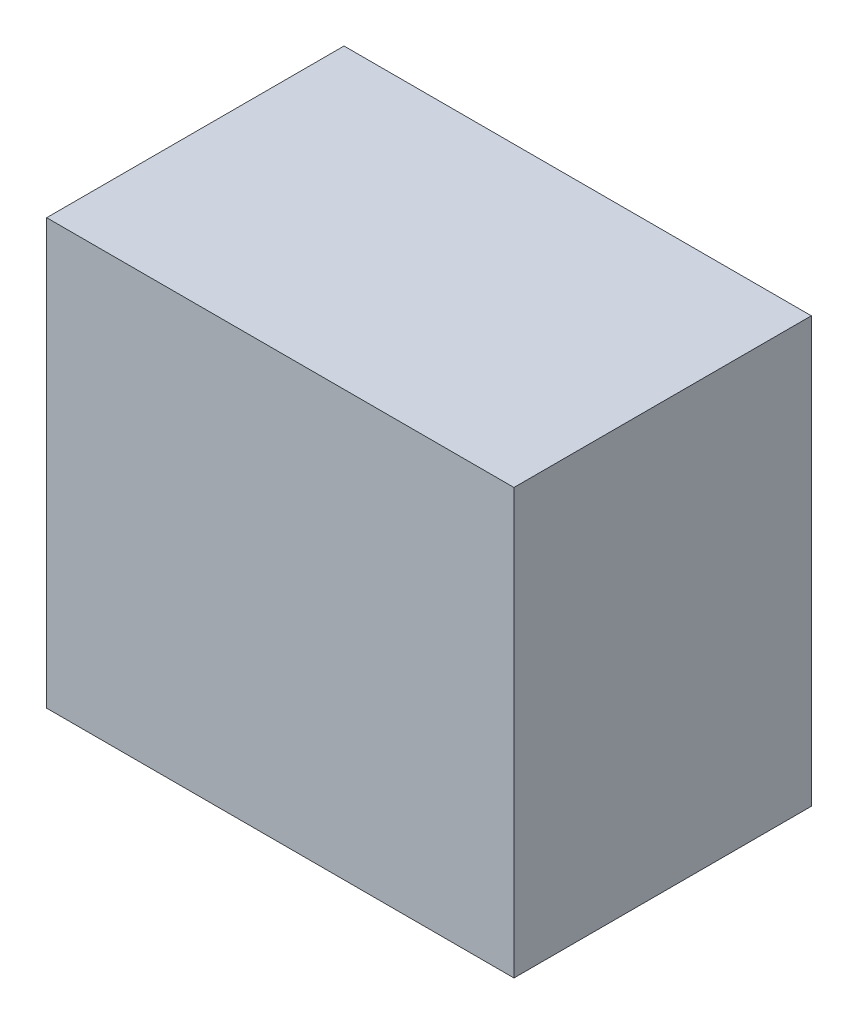
ISO-10303-21;
HEADER;
FILE_DESCRIPTION(('STEP AP214'),'2;1');
FILE_NAME('part.step','',(''),(''),'','','');
FILE_SCHEMA(('AUTOMOTIVE_DESIGN { 1 0 10303 214 1 1 1 1 }'));
ENDSEC;
DATA;
#1=APPLICATION_CONTEXT('core data for automotive mechanical design processes');
#2=APPLICATION_PROTOCOL_DEFINITION('international standard','automotive_design',2000,#1);
#3=PRODUCT_CONTEXT('',#1,'mechanical');
#4=PRODUCT('Part','Part','',(#3));
#5=PRODUCT_RELATED_PRODUCT_CATEGORY('part','',(#4));
#6=PRODUCT_DEFINITION_FORMATION('','',#4);
#7=PRODUCT_DEFINITION_CONTEXT('part definition',#1,'design');
#8=PRODUCT_DEFINITION('design','',#6,#7);
#9=PRODUCT_DEFINITION_SHAPE('','',#8);
#10=(LENGTH_UNIT() NAMED_UNIT(*) SI_UNIT(.MILLI.,.METRE.));
#11=(NAMED_UNIT(*) PLANE_ANGLE_UNIT() SI_UNIT($,.RADIAN.));
#12=(NAMED_UNIT(*) SI_UNIT($,.STERADIAN.) SOLID_ANGLE_UNIT());
#13=UNCERTAINTY_MEASURE_WITH_UNIT(LENGTH_MEASURE(1.E-05),#10,'distance_accuracy_value','');
#14=(GEOMETRIC_REPRESENTATION_CONTEXT(3) GLOBAL_UNCERTAINTY_ASSIGNED_CONTEXT((#13)) GLOBAL_UNIT_ASSIGNED_CONTEXT((#10,
#11,#12)) REPRESENTATION_CONTEXT('',''));
#15=CARTESIAN_POINT('',(0.,0.,0.));
#16=DIRECTION('',(0.,0.,1.));
#17=DIRECTION('',(1.,0.,0.));
#18=AXIS2_PLACEMENT_3D('',#15,#16,#17);
#19=CARTESIAN_POINT('',(0.,0.,350.));
#20=DIRECTION('',(1.,0.,0.));
#21=DIRECTION('',(0.,0.,-1.));
#22=AXIS2_PLACEMENT_3D('',#19,#20,#21);
#23=PLANE('',#22);
#24=DIRECTION('',(0.,-1.,0.));
#25=VECTOR('',#24,1.);
#26=CARTESIAN_POINT('',(0.,0.,0.));
#27=LINE('',#26,#25);
#28=CARTESIAN_POINT('',(0.,500.,0.));
#29=VERTEX_POINT('',#28);
#30=CARTESIAN_POINT('',(0.,0.,0.));
#31=VERTEX_POINT('',#30);
#32=EDGE_CURVE('E100',#29,#31,#27,.T.);
#33=ORIENTED_EDGE('',*,*,#32,.T.);
#34=DIRECTION('',(0.,0.,-1.));
#35=VECTOR('',#34,1.);
#36=CARTESIAN_POINT('',(0.,0.,350.));
#37=LINE('',#36,#35);
#38=CARTESIAN_POINT('',(0.,0.,350.));
#39=VERTEX_POINT('',#38);
#40=EDGE_CURVE('E11',#39,#31,#37,.T.);
#41=ORIENTED_EDGE('',*,*,#40,.F.);
#42=DIRECTION('',(0.,-1.,0.));
#43=VECTOR('',#42,1.);
#44=CARTESIAN_POINT('',(0.,0.,350.));
#45=LINE('',#44,#43);
#46=CARTESIAN_POINT('',(0.,500.,350.));
#47=VERTEX_POINT('',#46);
#48=EDGE_CURVE('E88',#47,#39,#45,.T.);
#49=ORIENTED_EDGE('',*,*,#48,.F.);
#50=DIRECTION('',(0.,0.,-1.));
#51=VECTOR('',#50,1.);
#52=CARTESIAN_POINT('',(0.,500.,350.));
#53=LINE('',#52,#51);
#54=EDGE_CURVE('E96',#47,#29,#53,.T.);
#55=ORIENTED_EDGE('',*,*,#54,.T.);
#56=EDGE_LOOP('',(#33,#41,#49,#55));
#57=FACE_BOUND('',#56,.T.);
#58=ADVANCED_FACE('F37',(#57),#23,.F.);
#59=CARTESIAN_POINT('',(0.,0.,350.));
#60=DIRECTION('',(0.,1.,0.));
#61=DIRECTION('',(0.,0.,1.));
#62=AXIS2_PLACEMENT_3D('',#59,#60,#61);
#63=PLANE('',#62);
#64=DIRECTION('',(1.,0.,0.));
#65=VECTOR('',#64,1.);
#66=CARTESIAN_POINT('',(0.,0.,0.));
#67=LINE('',#66,#65);
#68=CARTESIAN_POINT('',(550.,0.,0.));
#69=VERTEX_POINT('',#68);
#70=EDGE_CURVE('E92',#31,#69,#67,.T.);
#71=ORIENTED_EDGE('',*,*,#70,.T.);
#72=DIRECTION('',(0.,0.,-1.));
#73=VECTOR('',#72,1.);
#74=CARTESIAN_POINT('',(550.,0.,350.));
#75=LINE('',#74,#73);
#76=CARTESIAN_POINT('',(550.,0.,350.));
#77=VERTEX_POINT('',#76);
#78=EDGE_CURVE('E45',#77,#69,#75,.T.);
#79=ORIENTED_EDGE('',*,*,#78,.F.);
#80=DIRECTION('',(1.,0.,0.));
#81=VECTOR('',#80,1.);
#82=CARTESIAN_POINT('',(0.,0.,350.));
#83=LINE('',#82,#81);
#84=EDGE_CURVE('E83',#39,#77,#83,.T.);
#85=ORIENTED_EDGE('',*,*,#84,.F.);
#86=ORIENTED_EDGE('',*,*,#40,.T.);
#87=EDGE_LOOP('',(#71,#79,#85,#86));
#88=FACE_BOUND('',#87,.T.);
#89=ADVANCED_FACE('F91',(#88),#63,.F.);
#90=CARTESIAN_POINT('',(550.,0.,350.));
#91=DIRECTION('',(-1.,0.,0.));
#92=DIRECTION('',(0.,0.,1.));
#93=AXIS2_PLACEMENT_3D('',#90,#91,#92);
#94=PLANE('',#93);
#95=DIRECTION('',(0.,1.,0.));
#96=VECTOR('',#95,1.);
#97=CARTESIAN_POINT('',(550.,0.,0.));
#98=LINE('',#97,#96);
#99=CARTESIAN_POINT('',(550.,500.,0.));
#100=VERTEX_POINT('',#99);
#101=EDGE_CURVE('E70',#69,#100,#98,.T.);
#102=ORIENTED_EDGE('',*,*,#101,.T.);
#103=DIRECTION('',(0.,0.,-1.));
#104=VECTOR('',#103,1.);
#105=CARTESIAN_POINT('',(550.,500.,350.));
#106=LINE('',#105,#104);
#107=CARTESIAN_POINT('',(550.,500.,350.));
#108=VERTEX_POINT('',#107);
#109=EDGE_CURVE('E93',#108,#100,#106,.T.);
#110=ORIENTED_EDGE('',*,*,#109,.F.);
#111=DIRECTION('',(0.,1.,0.));
#112=VECTOR('',#111,1.);
#113=CARTESIAN_POINT('',(550.,0.,350.));
#114=LINE('',#113,#112);
#115=EDGE_CURVE('E86',#77,#108,#114,.T.);
#116=ORIENTED_EDGE('',*,*,#115,.F.);
#117=ORIENTED_EDGE('',*,*,#78,.T.);
#118=EDGE_LOOP('',(#102,#110,#116,#117));
#119=FACE_BOUND('',#118,.T.);
#120=ADVANCED_FACE('F94',(#119),#94,.F.);
#121=CARTESIAN_POINT('',(0.,500.,350.));
#122=DIRECTION('',(0.,-1.,0.));
#123=DIRECTION('',(0.,0.,-1.));
#124=AXIS2_PLACEMENT_3D('',#121,#122,#123);
#125=PLANE('',#124);
#126=DIRECTION('',(-1.,0.,0.));
#127=VECTOR('',#126,1.);
#128=CARTESIAN_POINT('',(0.,500.,0.));
#129=LINE('',#128,#127);
#130=EDGE_CURVE('E76',#100,#29,#129,.T.);
#131=ORIENTED_EDGE('',*,*,#130,.T.);
#132=ORIENTED_EDGE('',*,*,#54,.F.);
#133=DIRECTION('',(-1.,0.,0.));
#134=VECTOR('',#133,1.);
#135=CARTESIAN_POINT('',(0.,500.,350.));
#136=LINE('',#135,#134);
#137=EDGE_CURVE('E53',#108,#47,#136,.T.);
#138=ORIENTED_EDGE('',*,*,#137,.F.);
#139=ORIENTED_EDGE('',*,*,#109,.T.);
#140=EDGE_LOOP('',(#131,#132,#138,#139));
#141=FACE_BOUND('',#140,.T.);
#142=ADVANCED_FACE('F107',(#141),#125,.F.);
#143=CARTESIAN_POINT('',(0.,0.,350.));
#144=DIRECTION('',(0.,0.,-1.));
#145=DIRECTION('',(-1.,0.,0.));
#146=AXIS2_PLACEMENT_3D('',#143,#144,#145);
#147=PLANE('',#146);
#148=ORIENTED_EDGE('',*,*,#48,.T.);
#149=ORIENTED_EDGE('',*,*,#84,.T.);
#150=ORIENTED_EDGE('',*,*,#115,.T.);
#151=ORIENTED_EDGE('',*,*,#137,.T.);
#152=EDGE_LOOP('',(#148,#149,#150,#151));
#153=FACE_BOUND('',#152,.T.);
#154=ADVANCED_FACE('F84',(#153),#147,.F.);
#155=CARTESIAN_POINT('',(0.,0.,0.));
#156=DIRECTION('',(0.,0.,-1.));
#157=DIRECTION('',(-1.,0.,0.));
#158=AXIS2_PLACEMENT_3D('',#155,#156,#157);
#159=PLANE('',#158);
#160=ORIENTED_EDGE('',*,*,#32,.F.);
#161=ORIENTED_EDGE('',*,*,#130,.F.);
#162=ORIENTED_EDGE('',*,*,#101,.F.);
#163=ORIENTED_EDGE('',*,*,#70,.F.);
#164=EDGE_LOOP('',(#160,#161,#162,#163));
#165=FACE_BOUND('',#164,.T.);
#166=ADVANCED_FACE('F110',(#165),#159,.T.);
#167=CLOSED_SHELL('',(#58,#89,#120,#142,#154,#166));
#168=MANIFOLD_SOLID_BREP('B2',#167);
#169=ADVANCED_BREP_SHAPE_REPRESENTATION('',(#18,#168),#14);
#170=SHAPE_DEFINITION_REPRESENTATION(#9,#169);
ENDSEC;
END-ISO-10303-21;
